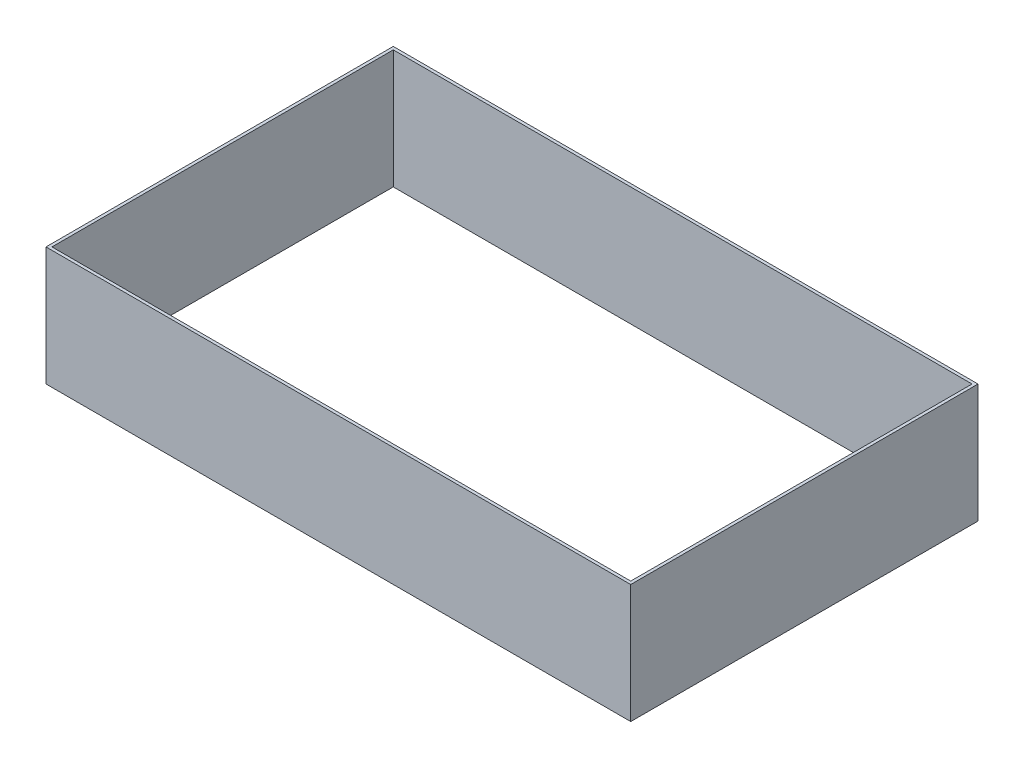
ISO-10303-21;
HEADER;
FILE_DESCRIPTION(('STEP AP214'),'2;1');
FILE_NAME('part.step','',(''),(''),'','','');
FILE_SCHEMA(('AUTOMOTIVE_DESIGN { 1 0 10303 214 1 1 1 1 }'));
ENDSEC;
DATA;
#1=APPLICATION_CONTEXT('core data for automotive mechanical design processes');
#2=APPLICATION_PROTOCOL_DEFINITION('international standard','automotive_design',2000,#1);
#3=PRODUCT_CONTEXT('',#1,'mechanical');
#4=PRODUCT('Part','Part','',(#3));
#5=PRODUCT_RELATED_PRODUCT_CATEGORY('part','',(#4));
#6=PRODUCT_DEFINITION_FORMATION('','',#4);
#7=PRODUCT_DEFINITION_CONTEXT('part definition',#1,'design');
#8=PRODUCT_DEFINITION('design','',#6,#7);
#9=PRODUCT_DEFINITION_SHAPE('','',#8);
#10=(LENGTH_UNIT() NAMED_UNIT(*) SI_UNIT(.MILLI.,.METRE.));
#11=(NAMED_UNIT(*) PLANE_ANGLE_UNIT() SI_UNIT($,.RADIAN.));
#12=(NAMED_UNIT(*) SI_UNIT($,.STERADIAN.) SOLID_ANGLE_UNIT());
#13=UNCERTAINTY_MEASURE_WITH_UNIT(LENGTH_MEASURE(1.E-05),#10,'distance_accuracy_value','');
#14=(GEOMETRIC_REPRESENTATION_CONTEXT(3) GLOBAL_UNCERTAINTY_ASSIGNED_CONTEXT((#13)) GLOBAL_UNIT_ASSIGNED_CONTEXT((#10,
#11,#12)) REPRESENTATION_CONTEXT('',''));
#15=CARTESIAN_POINT('',(0.,0.,0.));
#16=DIRECTION('',(0.,0.,1.));
#17=DIRECTION('',(1.,0.,0.));
#18=AXIS2_PLACEMENT_3D('',#15,#16,#17);
#19=CARTESIAN_POINT('',(0.,400.,0.));
#20=DIRECTION('',(0.,1.,0.));
#21=DIRECTION('',(0.,0.,1.));
#22=AXIS2_PLACEMENT_3D('',#19,#20,#21);
#23=PLANE('',#22);
#24=DIRECTION('',(0.,0.,-1.));
#25=VECTOR('',#24,1.);
#26=CARTESIAN_POINT('',(985.,400.,-575.));
#27=LINE('',#26,#25);
#28=CARTESIAN_POINT('',(985.000000000001,400.,585.));
#29=VERTEX_POINT('',#28);
#30=CARTESIAN_POINT('',(985.,400.,-585.));
#31=VERTEX_POINT('',#30);
#32=EDGE_CURVE('E158',#29,#31,#27,.T.);
#33=ORIENTED_EDGE('',*,*,#32,.T.);
#34=DIRECTION('',(-1.,0.,0.));
#35=VECTOR('',#34,1.);
#36=CARTESIAN_POINT('',(-975.,400.,-585.));
#37=LINE('',#36,#35);
#38=CARTESIAN_POINT('',(-985.,400.,-585.));
#39=VERTEX_POINT('',#38);
#40=EDGE_CURVE('E161',#31,#39,#37,.T.);
#41=ORIENTED_EDGE('',*,*,#40,.T.);
#42=DIRECTION('',(0.,0.,1.));
#43=VECTOR('',#42,1.);
#44=CARTESIAN_POINT('',(-985.,400.,-575.));
#45=LINE('',#44,#43);
#46=CARTESIAN_POINT('',(-984.999999999999,400.,585.));
#47=VERTEX_POINT('',#46);
#48=EDGE_CURVE('E164',#39,#47,#45,.T.);
#49=ORIENTED_EDGE('',*,*,#48,.T.);
#50=DIRECTION('',(1.,0.,0.));
#51=VECTOR('',#50,1.);
#52=CARTESIAN_POINT('',(-974.999999999999,400.,585.));
#53=LINE('',#52,#51);
#54=EDGE_CURVE('E166',#47,#29,#53,.T.);
#55=ORIENTED_EDGE('',*,*,#54,.T.);
#56=EDGE_LOOP('',(#33,#41,#49,#55));
#57=FACE_BOUND('',#56,.T.);
#58=DIRECTION('',(-1.,0.,0.));
#59=VECTOR('',#58,1.);
#60=CARTESIAN_POINT('',(-975.,400.,-575.));
#61=LINE('',#60,#59);
#62=CARTESIAN_POINT('',(975.,400.,-575.));
#63=VERTEX_POINT('',#62);
#64=CARTESIAN_POINT('',(-975.,400.,-575.));
#65=VERTEX_POINT('',#64);
#66=EDGE_CURVE('E130',#63,#65,#61,.T.);
#67=ORIENTED_EDGE('',*,*,#66,.F.);
#68=DIRECTION('',(0.,0.,-1.));
#69=VECTOR('',#68,1.);
#70=CARTESIAN_POINT('',(975.,400.,-575.));
#71=LINE('',#70,#69);
#72=CARTESIAN_POINT('',(975.000000000001,400.,575.));
#73=VERTEX_POINT('',#72);
#74=EDGE_CURVE('E122',#73,#63,#71,.T.);
#75=ORIENTED_EDGE('',*,*,#74,.F.);
#76=DIRECTION('',(1.,0.,0.));
#77=VECTOR('',#76,1.);
#78=CARTESIAN_POINT('',(-974.999999999999,400.,575.));
#79=LINE('',#78,#77);
#80=CARTESIAN_POINT('',(-974.999999999999,400.,575.));
#81=VERTEX_POINT('',#80);
#82=EDGE_CURVE('E144',#81,#73,#79,.T.);
#83=ORIENTED_EDGE('',*,*,#82,.F.);
#84=DIRECTION('',(0.,0.,1.));
#85=VECTOR('',#84,1.);
#86=CARTESIAN_POINT('',(-975.,400.,-575.));
#87=LINE('',#86,#85);
#88=EDGE_CURVE('E142',#65,#81,#87,.T.);
#89=ORIENTED_EDGE('',*,*,#88,.F.);
#90=EDGE_LOOP('',(#67,#75,#83,#89));
#91=FACE_BOUND('',#90,.T.);
#92=ADVANCED_FACE('F57',(#57,#91),#23,.T.);
#93=CARTESIAN_POINT('',(0.,0.,0.));
#94=DIRECTION('',(0.,1.,0.));
#95=DIRECTION('',(0.,0.,1.));
#96=AXIS2_PLACEMENT_3D('',#93,#94,#95);
#97=PLANE('',#96);
#98=DIRECTION('',(0.,0.,-1.));
#99=VECTOR('',#98,1.);
#100=CARTESIAN_POINT('',(985.,0.,-575.));
#101=LINE('',#100,#99);
#102=CARTESIAN_POINT('',(985.000000000001,0.,585.));
#103=VERTEX_POINT('',#102);
#104=CARTESIAN_POINT('',(985.,0.,-585.));
#105=VERTEX_POINT('',#104);
#106=EDGE_CURVE('E138',#103,#105,#101,.T.);
#107=ORIENTED_EDGE('',*,*,#106,.F.);
#108=DIRECTION('',(1.,0.,0.));
#109=VECTOR('',#108,1.);
#110=CARTESIAN_POINT('',(-974.999999999999,0.,585.));
#111=LINE('',#110,#109);
#112=CARTESIAN_POINT('',(-984.999999999999,0.,585.));
#113=VERTEX_POINT('',#112);
#114=EDGE_CURVE('E162',#113,#103,#111,.T.);
#115=ORIENTED_EDGE('',*,*,#114,.F.);
#116=DIRECTION('',(0.,0.,1.));
#117=VECTOR('',#116,1.);
#118=CARTESIAN_POINT('',(-985.,0.,-575.));
#119=LINE('',#118,#117);
#120=CARTESIAN_POINT('',(-985.,0.,-585.));
#121=VERTEX_POINT('',#120);
#122=EDGE_CURVE('E173',#121,#113,#119,.T.);
#123=ORIENTED_EDGE('',*,*,#122,.F.);
#124=DIRECTION('',(-1.,0.,0.));
#125=VECTOR('',#124,1.);
#126=CARTESIAN_POINT('',(-975.,0.,-585.));
#127=LINE('',#126,#125);
#128=EDGE_CURVE('E171',#105,#121,#127,.T.);
#129=ORIENTED_EDGE('',*,*,#128,.F.);
#130=EDGE_LOOP('',(#107,#115,#123,#129));
#131=FACE_BOUND('',#130,.T.);
#132=DIRECTION('',(0.,0.,-1.));
#133=VECTOR('',#132,1.);
#134=CARTESIAN_POINT('',(975.,0.,-575.));
#135=LINE('',#134,#133);
#136=CARTESIAN_POINT('',(975.000000000001,0.,575.));
#137=VERTEX_POINT('',#136);
#138=CARTESIAN_POINT('',(975.,0.,-575.));
#139=VERTEX_POINT('',#138);
#140=EDGE_CURVE('E80',#137,#139,#135,.T.);
#141=ORIENTED_EDGE('',*,*,#140,.T.);
#142=DIRECTION('',(-1.,0.,0.));
#143=VECTOR('',#142,1.);
#144=CARTESIAN_POINT('',(-975.,0.,-575.));
#145=LINE('',#144,#143);
#146=CARTESIAN_POINT('',(-975.,0.,-575.));
#147=VERTEX_POINT('',#146);
#148=EDGE_CURVE('E137',#139,#147,#145,.T.);
#149=ORIENTED_EDGE('',*,*,#148,.T.);
#150=DIRECTION('',(0.,0.,1.));
#151=VECTOR('',#150,1.);
#152=CARTESIAN_POINT('',(-975.,0.,-575.));
#153=LINE('',#152,#151);
#154=CARTESIAN_POINT('',(-974.999999999999,0.,575.));
#155=VERTEX_POINT('',#154);
#156=EDGE_CURVE('E150',#147,#155,#153,.T.);
#157=ORIENTED_EDGE('',*,*,#156,.T.);
#158=DIRECTION('',(1.,0.,0.));
#159=VECTOR('',#158,1.);
#160=CARTESIAN_POINT('',(-974.999999999999,0.,575.));
#161=LINE('',#160,#159);
#162=EDGE_CURVE('E131',#155,#137,#161,.T.);
#163=ORIENTED_EDGE('',*,*,#162,.T.);
#164=EDGE_LOOP('',(#141,#149,#157,#163));
#165=FACE_BOUND('',#164,.T.);
#166=ADVANCED_FACE('F191',(#131,#165),#97,.F.);
#167=CARTESIAN_POINT('',(985.,400.,-575.));
#168=DIRECTION('',(-1.,0.,0.));
#169=DIRECTION('',(0.,0.,1.));
#170=AXIS2_PLACEMENT_3D('',#167,#168,#169);
#171=PLANE('',#170);
#172=ORIENTED_EDGE('',*,*,#106,.T.);
#173=DIRECTION('',(0.,-1.,0.));
#174=VECTOR('',#173,1.);
#175=CARTESIAN_POINT('',(985.,400.,-585.));
#176=LINE('',#175,#174);
#177=EDGE_CURVE('E12',#31,#105,#176,.T.);
#178=ORIENTED_EDGE('',*,*,#177,.F.);
#179=ORIENTED_EDGE('',*,*,#32,.F.);
#180=DIRECTION('',(0.,-1.,0.));
#181=VECTOR('',#180,1.);
#182=CARTESIAN_POINT('',(985.000000000001,400.,585.));
#183=LINE('',#182,#181);
#184=EDGE_CURVE('E168',#29,#103,#183,.T.);
#185=ORIENTED_EDGE('',*,*,#184,.T.);
#186=EDGE_LOOP('',(#172,#178,#179,#185));
#187=FACE_BOUND('',#186,.T.);
#188=ADVANCED_FACE('F59',(#187),#171,.F.);
#189=CARTESIAN_POINT('',(-975.,400.,-585.));
#190=DIRECTION('',(0.,0.,1.));
#191=DIRECTION('',(1.,0.,0.));
#192=AXIS2_PLACEMENT_3D('',#189,#190,#191);
#193=PLANE('',#192);
#194=ORIENTED_EDGE('',*,*,#128,.T.);
#195=DIRECTION('',(0.,-1.,0.));
#196=VECTOR('',#195,1.);
#197=CARTESIAN_POINT('',(-985.,400.,-585.));
#198=LINE('',#197,#196);
#199=EDGE_CURVE('E65',#39,#121,#198,.T.);
#200=ORIENTED_EDGE('',*,*,#199,.F.);
#201=ORIENTED_EDGE('',*,*,#40,.F.);
#202=ORIENTED_EDGE('',*,*,#177,.T.);
#203=EDGE_LOOP('',(#194,#200,#201,#202));
#204=FACE_BOUND('',#203,.T.);
#205=ADVANCED_FACE('F201',(#204),#193,.F.);
#206=CARTESIAN_POINT('',(-985.,400.,-575.));
#207=DIRECTION('',(1.,0.,0.));
#208=DIRECTION('',(0.,0.,-1.));
#209=AXIS2_PLACEMENT_3D('',#206,#207,#208);
#210=PLANE('',#209);
#211=ORIENTED_EDGE('',*,*,#122,.T.);
#212=DIRECTION('',(0.,-1.,0.));
#213=VECTOR('',#212,1.);
#214=CARTESIAN_POINT('',(-984.999999999999,400.,585.));
#215=LINE('',#214,#213);
#216=EDGE_CURVE('E178',#47,#113,#215,.T.);
#217=ORIENTED_EDGE('',*,*,#216,.F.);
#218=ORIENTED_EDGE('',*,*,#48,.F.);
#219=ORIENTED_EDGE('',*,*,#199,.T.);
#220=EDGE_LOOP('',(#211,#217,#218,#219));
#221=FACE_BOUND('',#220,.T.);
#222=ADVANCED_FACE('F185',(#221),#210,.F.);
#223=CARTESIAN_POINT('',(-974.999999999999,400.,585.));
#224=DIRECTION('',(0.,0.,-1.));
#225=DIRECTION('',(-1.,0.,0.));
#226=AXIS2_PLACEMENT_3D('',#223,#224,#225);
#227=PLANE('',#226);
#228=ORIENTED_EDGE('',*,*,#114,.T.);
#229=ORIENTED_EDGE('',*,*,#184,.F.);
#230=ORIENTED_EDGE('',*,*,#54,.F.);
#231=ORIENTED_EDGE('',*,*,#216,.T.);
#232=EDGE_LOOP('',(#228,#229,#230,#231));
#233=FACE_BOUND('',#232,.T.);
#234=ADVANCED_FACE('F195',(#233),#227,.F.);
#235=CARTESIAN_POINT('',(975.,400.,-575.));
#236=DIRECTION('',(-1.,0.,0.));
#237=DIRECTION('',(0.,0.,1.));
#238=AXIS2_PLACEMENT_3D('',#235,#236,#237);
#239=PLANE('',#238);
#240=ORIENTED_EDGE('',*,*,#140,.F.);
#241=DIRECTION('',(0.,-1.,0.));
#242=VECTOR('',#241,1.);
#243=CARTESIAN_POINT('',(975.000000000001,400.,575.));
#244=LINE('',#243,#242);
#245=EDGE_CURVE('E126',#73,#137,#244,.T.);
#246=ORIENTED_EDGE('',*,*,#245,.F.);
#247=ORIENTED_EDGE('',*,*,#74,.T.);
#248=DIRECTION('',(0.,-1.,0.));
#249=VECTOR('',#248,1.);
#250=CARTESIAN_POINT('',(975.,400.,-575.));
#251=LINE('',#250,#249);
#252=EDGE_CURVE('E125',#63,#139,#251,.T.);
#253=ORIENTED_EDGE('',*,*,#252,.T.);
#254=EDGE_LOOP('',(#240,#246,#247,#253));
#255=FACE_BOUND('',#254,.T.);
#256=ADVANCED_FACE('F124',(#255),#239,.T.);
#257=CARTESIAN_POINT('',(-975.,400.,-575.));
#258=DIRECTION('',(0.,0.,1.));
#259=DIRECTION('',(1.,0.,0.));
#260=AXIS2_PLACEMENT_3D('',#257,#258,#259);
#261=PLANE('',#260);
#262=ORIENTED_EDGE('',*,*,#148,.F.);
#263=ORIENTED_EDGE('',*,*,#252,.F.);
#264=ORIENTED_EDGE('',*,*,#66,.T.);
#265=DIRECTION('',(0.,-1.,0.));
#266=VECTOR('',#265,1.);
#267=CARTESIAN_POINT('',(-975.,400.,-575.));
#268=LINE('',#267,#266);
#269=EDGE_CURVE('E139',#65,#147,#268,.T.);
#270=ORIENTED_EDGE('',*,*,#269,.T.);
#271=EDGE_LOOP('',(#262,#263,#264,#270));
#272=FACE_BOUND('',#271,.T.);
#273=ADVANCED_FACE('F134',(#272),#261,.T.);
#274=CARTESIAN_POINT('',(-975.,400.,-575.));
#275=DIRECTION('',(1.,0.,0.));
#276=DIRECTION('',(0.,0.,-1.));
#277=AXIS2_PLACEMENT_3D('',#274,#275,#276);
#278=PLANE('',#277);
#279=ORIENTED_EDGE('',*,*,#156,.F.);
#280=ORIENTED_EDGE('',*,*,#269,.F.);
#281=ORIENTED_EDGE('',*,*,#88,.T.);
#282=DIRECTION('',(0.,-1.,0.));
#283=VECTOR('',#282,1.);
#284=CARTESIAN_POINT('',(-974.999999999999,400.,575.));
#285=LINE('',#284,#283);
#286=EDGE_CURVE('E72',#81,#155,#285,.T.);
#287=ORIENTED_EDGE('',*,*,#286,.T.);
#288=EDGE_LOOP('',(#279,#280,#281,#287));
#289=FACE_BOUND('',#288,.T.);
#290=ADVANCED_FACE('F224',(#289),#278,.T.);
#291=CARTESIAN_POINT('',(-974.999999999999,400.,575.));
#292=DIRECTION('',(0.,0.,-1.));
#293=DIRECTION('',(-1.,0.,0.));
#294=AXIS2_PLACEMENT_3D('',#291,#292,#293);
#295=PLANE('',#294);
#296=ORIENTED_EDGE('',*,*,#162,.F.);
#297=ORIENTED_EDGE('',*,*,#286,.F.);
#298=ORIENTED_EDGE('',*,*,#82,.T.);
#299=ORIENTED_EDGE('',*,*,#245,.T.);
#300=EDGE_LOOP('',(#296,#297,#298,#299));
#301=FACE_BOUND('',#300,.T.);
#302=ADVANCED_FACE('F228',(#301),#295,.T.);
#303=CLOSED_SHELL('',(#92,#166,#188,#205,#222,#234,#256,#273,#290,#302));
#304=MANIFOLD_SOLID_BREP('B2',#303);
#305=ADVANCED_BREP_SHAPE_REPRESENTATION('',(#18,#304),#14);
#306=SHAPE_DEFINITION_REPRESENTATION(#9,#305);
ENDSEC;
END-ISO-10303-21;
